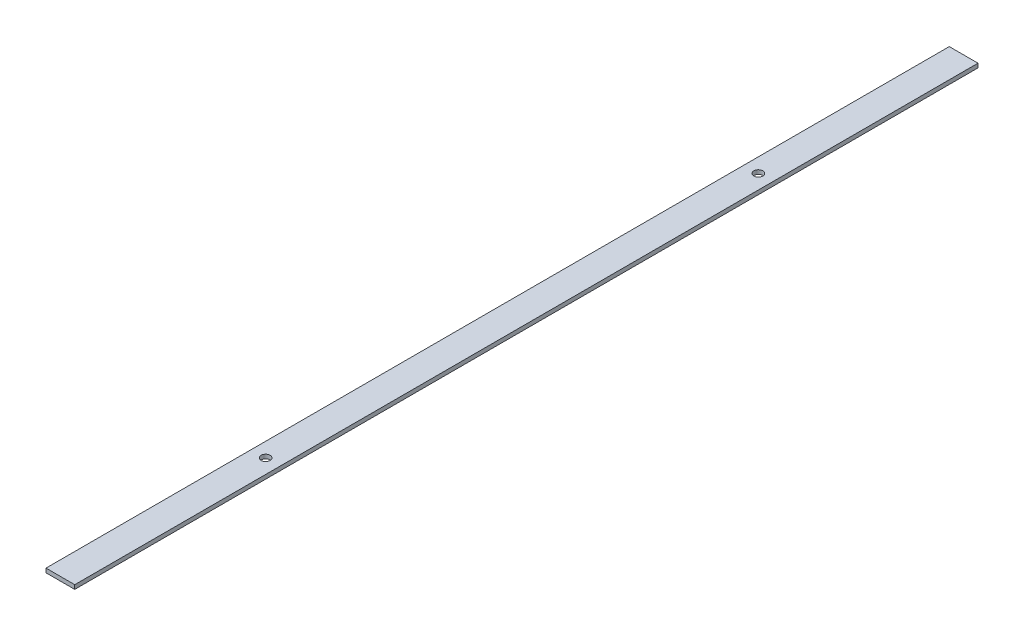
ISO-10303-21;
HEADER;
FILE_DESCRIPTION(('STEP AP214'),'2;1');
FILE_NAME('part.step','',(''),(''),'','','');
FILE_SCHEMA(('AUTOMOTIVE_DESIGN { 1 0 10303 214 1 1 1 1 }'));
ENDSEC;
DATA;
#1=APPLICATION_CONTEXT('core data for automotive mechanical design processes');
#2=APPLICATION_PROTOCOL_DEFINITION('international standard','automotive_design',2000,#1);
#3=PRODUCT_CONTEXT('',#1,'mechanical');
#4=PRODUCT('Part','Part','',(#3));
#5=PRODUCT_RELATED_PRODUCT_CATEGORY('part','',(#4));
#6=PRODUCT_DEFINITION_FORMATION('','',#4);
#7=PRODUCT_DEFINITION_CONTEXT('part definition',#1,'design');
#8=PRODUCT_DEFINITION('design','',#6,#7);
#9=PRODUCT_DEFINITION_SHAPE('','',#8);
#10=(LENGTH_UNIT() NAMED_UNIT(*) SI_UNIT(.MILLI.,.METRE.));
#11=(NAMED_UNIT(*) PLANE_ANGLE_UNIT() SI_UNIT($,.RADIAN.));
#12=(NAMED_UNIT(*) SI_UNIT($,.STERADIAN.) SOLID_ANGLE_UNIT());
#13=UNCERTAINTY_MEASURE_WITH_UNIT(LENGTH_MEASURE(1.E-05),#10,'distance_accuracy_value','');
#14=(GEOMETRIC_REPRESENTATION_CONTEXT(3) GLOBAL_UNCERTAINTY_ASSIGNED_CONTEXT((#13)) GLOBAL_UNIT_ASSIGNED_CONTEXT((#10,
#11,#12)) REPRESENTATION_CONTEXT('',''));
#15=CARTESIAN_POINT('',(0.,0.,0.));
#16=DIRECTION('',(0.,0.,1.));
#17=DIRECTION('',(1.,0.,0.));
#18=AXIS2_PLACEMENT_3D('',#15,#16,#17);
#19=CARTESIAN_POINT('',(0.,0.,-2200.));
#20=DIRECTION('',(-1.,0.,0.));
#21=DIRECTION('',(0.,0.,1.));
#22=AXIS2_PLACEMENT_3D('',#19,#20,#21);
#23=PLANE('',#22);
#24=DIRECTION('',(0.,-1.,0.));
#25=VECTOR('',#24,1.);
#26=CARTESIAN_POINT('',(0.,0.,0.));
#27=LINE('',#26,#25);
#28=CARTESIAN_POINT('',(0.,10.,0.));
#29=VERTEX_POINT('',#28);
#30=CARTESIAN_POINT('',(0.,0.,0.));
#31=VERTEX_POINT('',#30);
#32=EDGE_CURVE('E99',#29,#31,#27,.T.);
#33=ORIENTED_EDGE('',*,*,#32,.F.);
#34=DIRECTION('',(0.,0.,1.));
#35=VECTOR('',#34,1.);
#36=CARTESIAN_POINT('',(0.,10.,-2200.));
#37=LINE('',#36,#35);
#38=CARTESIAN_POINT('',(0.,10.,-2200.));
#39=VERTEX_POINT('',#38);
#40=EDGE_CURVE('E11',#39,#29,#37,.T.);
#41=ORIENTED_EDGE('',*,*,#40,.F.);
#42=DIRECTION('',(0.,-1.,0.));
#43=VECTOR('',#42,1.);
#44=CARTESIAN_POINT('',(0.,0.,-2200.));
#45=LINE('',#44,#43);
#46=CARTESIAN_POINT('',(0.,0.,-2200.));
#47=VERTEX_POINT('',#46);
#48=EDGE_CURVE('E92',#39,#47,#45,.T.);
#49=ORIENTED_EDGE('',*,*,#48,.T.);
#50=DIRECTION('',(0.,0.,1.));
#51=VECTOR('',#50,1.);
#52=CARTESIAN_POINT('',(0.,0.,-2200.));
#53=LINE('',#52,#51);
#54=EDGE_CURVE('E37',#47,#31,#53,.T.);
#55=ORIENTED_EDGE('',*,*,#54,.T.);
#56=EDGE_LOOP('',(#33,#41,#49,#55));
#57=FACE_BOUND('',#56,.T.);
#58=ADVANCED_FACE('F34',(#57),#23,.T.);
#59=CARTESIAN_POINT('',(0.,10.,-2200.));
#60=DIRECTION('',(0.,1.,0.));
#61=DIRECTION('',(0.,0.,1.));
#62=AXIS2_PLACEMENT_3D('',#59,#60,#61);
#63=PLANE('',#62);
#64=CARTESIAN_POINT('',(35.,10.,-500.));
#65=DIRECTION('',(0.,1.,0.));
#66=DIRECTION('',(0.,0.,1.));
#67=AXIS2_PLACEMENT_3D('',#64,#65,#66);
#68=CIRCLE('',#67,11.);
#69=CARTESIAN_POINT('',(35.,10.,-489.));
#70=VERTEX_POINT('',#69);
#71=EDGE_CURVE('E139',#70,#70,#68,.T.);
#72=ORIENTED_EDGE('',*,*,#71,.F.);
#73=EDGE_LOOP('',(#72));
#74=FACE_BOUND('',#73,.T.);
#75=CARTESIAN_POINT('',(35.,10.,-1700.));
#76=DIRECTION('',(0.,1.,0.));
#77=DIRECTION('',(0.,0.,1.));
#78=AXIS2_PLACEMENT_3D('',#75,#76,#77);
#79=CIRCLE('',#78,11.);
#80=CARTESIAN_POINT('',(35.,10.,-1689.));
#81=VERTEX_POINT('',#80);
#82=EDGE_CURVE('E135',#81,#81,#79,.T.);
#83=ORIENTED_EDGE('',*,*,#82,.F.);
#84=EDGE_LOOP('',(#83));
#85=FACE_BOUND('',#84,.T.);
#86=DIRECTION('',(-1.,0.,0.));
#87=VECTOR('',#86,1.);
#88=CARTESIAN_POINT('',(0.,10.,0.));
#89=LINE('',#88,#87);
#90=CARTESIAN_POINT('',(70.,10.,0.));
#91=VERTEX_POINT('',#90);
#92=EDGE_CURVE('E94',#91,#29,#89,.T.);
#93=ORIENTED_EDGE('',*,*,#92,.F.);
#94=DIRECTION('',(0.,0.,1.));
#95=VECTOR('',#94,1.);
#96=CARTESIAN_POINT('',(70.,10.,-2200.));
#97=LINE('',#96,#95);
#98=CARTESIAN_POINT('',(70.,10.,-2200.));
#99=VERTEX_POINT('',#98);
#100=EDGE_CURVE('E43',#99,#91,#97,.T.);
#101=ORIENTED_EDGE('',*,*,#100,.F.);
#102=DIRECTION('',(-1.,0.,0.));
#103=VECTOR('',#102,1.);
#104=CARTESIAN_POINT('',(0.,10.,-2200.));
#105=LINE('',#104,#103);
#106=EDGE_CURVE('E89',#99,#39,#105,.T.);
#107=ORIENTED_EDGE('',*,*,#106,.T.);
#108=ORIENTED_EDGE('',*,*,#40,.T.);
#109=EDGE_LOOP('',(#93,#101,#107,#108));
#110=FACE_BOUND('',#109,.T.);
#111=ADVANCED_FACE('F110',(#74,#85,#110),#63,.T.);
#112=CARTESIAN_POINT('',(70.,0.,-2200.));
#113=DIRECTION('',(1.,0.,0.));
#114=DIRECTION('',(0.,0.,-1.));
#115=AXIS2_PLACEMENT_3D('',#112,#113,#114);
#116=PLANE('',#115);
#117=DIRECTION('',(0.,1.,0.));
#118=VECTOR('',#117,1.);
#119=CARTESIAN_POINT('',(70.,0.,0.));
#120=LINE('',#119,#118);
#121=CARTESIAN_POINT('',(70.,0.,0.));
#122=VERTEX_POINT('',#121);
#123=EDGE_CURVE('E84',#122,#91,#120,.T.);
#124=ORIENTED_EDGE('',*,*,#123,.F.);
#125=DIRECTION('',(0.,0.,1.));
#126=VECTOR('',#125,1.);
#127=CARTESIAN_POINT('',(70.,0.,-2200.));
#128=LINE('',#127,#126);
#129=CARTESIAN_POINT('',(70.,0.,-2200.));
#130=VERTEX_POINT('',#129);
#131=EDGE_CURVE('E79',#130,#122,#128,.T.);
#132=ORIENTED_EDGE('',*,*,#131,.F.);
#133=DIRECTION('',(0.,1.,0.));
#134=VECTOR('',#133,1.);
#135=CARTESIAN_POINT('',(70.,0.,-2200.));
#136=LINE('',#135,#134);
#137=EDGE_CURVE('E82',#130,#99,#136,.T.);
#138=ORIENTED_EDGE('',*,*,#137,.T.);
#139=ORIENTED_EDGE('',*,*,#100,.T.);
#140=EDGE_LOOP('',(#124,#132,#138,#139));
#141=FACE_BOUND('',#140,.T.);
#142=ADVANCED_FACE('F81',(#141),#116,.T.);
#143=CARTESIAN_POINT('',(0.,0.,-2200.));
#144=DIRECTION('',(0.,-1.,0.));
#145=DIRECTION('',(0.,0.,-1.));
#146=AXIS2_PLACEMENT_3D('',#143,#144,#145);
#147=PLANE('',#146);
#148=CARTESIAN_POINT('',(35.,0.,-500.));
#149=DIRECTION('',(0.,1.,0.));
#150=DIRECTION('',(0.,0.,1.));
#151=AXIS2_PLACEMENT_3D('',#148,#149,#150);
#152=CIRCLE('',#151,11.);
#153=CARTESIAN_POINT('',(35.,0.,-489.));
#154=VERTEX_POINT('',#153);
#155=EDGE_CURVE('E131',#154,#154,#152,.T.);
#156=ORIENTED_EDGE('',*,*,#155,.T.);
#157=EDGE_LOOP('',(#156));
#158=FACE_BOUND('',#157,.T.);
#159=CARTESIAN_POINT('',(35.,0.,-1700.));
#160=DIRECTION('',(0.,1.,0.));
#161=DIRECTION('',(0.,0.,1.));
#162=AXIS2_PLACEMENT_3D('',#159,#160,#161);
#163=CIRCLE('',#162,11.);
#164=CARTESIAN_POINT('',(35.,0.,-1689.));
#165=VERTEX_POINT('',#164);
#166=EDGE_CURVE('E103',#165,#165,#163,.T.);
#167=ORIENTED_EDGE('',*,*,#166,.T.);
#168=EDGE_LOOP('',(#167));
#169=FACE_BOUND('',#168,.T.);
#170=DIRECTION('',(1.,0.,0.));
#171=VECTOR('',#170,1.);
#172=CARTESIAN_POINT('',(0.,0.,0.));
#173=LINE('',#172,#171);
#174=EDGE_CURVE('E102',#31,#122,#173,.T.);
#175=ORIENTED_EDGE('',*,*,#174,.F.);
#176=ORIENTED_EDGE('',*,*,#54,.F.);
#177=DIRECTION('',(1.,0.,0.));
#178=VECTOR('',#177,1.);
#179=CARTESIAN_POINT('',(0.,0.,-2200.));
#180=LINE('',#179,#178);
#181=EDGE_CURVE('E88',#47,#130,#180,.T.);
#182=ORIENTED_EDGE('',*,*,#181,.T.);
#183=ORIENTED_EDGE('',*,*,#131,.T.);
#184=EDGE_LOOP('',(#175,#176,#182,#183));
#185=FACE_BOUND('',#184,.T.);
#186=ADVANCED_FACE('F91',(#158,#169,#185),#147,.T.);
#187=CARTESIAN_POINT('',(0.,0.,-2200.));
#188=DIRECTION('',(0.,0.,-1.));
#189=DIRECTION('',(-1.,0.,0.));
#190=AXIS2_PLACEMENT_3D('',#187,#188,#189);
#191=PLANE('',#190);
#192=ORIENTED_EDGE('',*,*,#48,.F.);
#193=ORIENTED_EDGE('',*,*,#106,.F.);
#194=ORIENTED_EDGE('',*,*,#137,.F.);
#195=ORIENTED_EDGE('',*,*,#181,.F.);
#196=EDGE_LOOP('',(#192,#193,#194,#195));
#197=FACE_BOUND('',#196,.T.);
#198=ADVANCED_FACE('F87',(#197),#191,.T.);
#199=CARTESIAN_POINT('',(0.,0.,0.));
#200=DIRECTION('',(0.,0.,-1.));
#201=DIRECTION('',(-1.,0.,0.));
#202=AXIS2_PLACEMENT_3D('',#199,#200,#201);
#203=PLANE('',#202);
#204=ORIENTED_EDGE('',*,*,#32,.T.);
#205=ORIENTED_EDGE('',*,*,#174,.T.);
#206=ORIENTED_EDGE('',*,*,#123,.T.);
#207=ORIENTED_EDGE('',*,*,#92,.T.);
#208=EDGE_LOOP('',(#204,#205,#206,#207));
#209=FACE_BOUND('',#208,.T.);
#210=ADVANCED_FACE('F109',(#209),#203,.F.);
#211=CARTESIAN_POINT('',(35.,0.,-1700.));
#212=DIRECTION('',(0.,1.,0.));
#213=DIRECTION('',(0.,0.,1.));
#214=AXIS2_PLACEMENT_3D('',#211,#212,#213);
#215=CYLINDRICAL_SURFACE('',#214,11.);
#216=ORIENTED_EDGE('',*,*,#166,.F.);
#217=EDGE_LOOP('',(#216));
#218=FACE_BOUND('',#217,.T.);
#219=ORIENTED_EDGE('',*,*,#82,.T.);
#220=EDGE_LOOP('',(#219));
#221=FACE_BOUND('',#220,.T.);
#222=ADVANCED_FACE('F145',(#218,#221),#215,.F.);
#223=CARTESIAN_POINT('',(35.,0.,-500.));
#224=DIRECTION('',(0.,1.,0.));
#225=DIRECTION('',(0.,0.,1.));
#226=AXIS2_PLACEMENT_3D('',#223,#224,#225);
#227=CYLINDRICAL_SURFACE('',#226,11.);
#228=ORIENTED_EDGE('',*,*,#155,.F.);
#229=EDGE_LOOP('',(#228));
#230=FACE_BOUND('',#229,.T.);
#231=ORIENTED_EDGE('',*,*,#71,.T.);
#232=EDGE_LOOP('',(#231));
#233=FACE_BOUND('',#232,.T.);
#234=ADVANCED_FACE('F143',(#230,#233),#227,.F.);
#235=CLOSED_SHELL('',(#58,#111,#142,#186,#198,#210,#222,#234));
#236=MANIFOLD_SOLID_BREP('B2',#235);
#237=ADVANCED_BREP_SHAPE_REPRESENTATION('',(#18,#236),#14);
#238=SHAPE_DEFINITION_REPRESENTATION(#9,#237);
ENDSEC;
END-ISO-10303-21;
